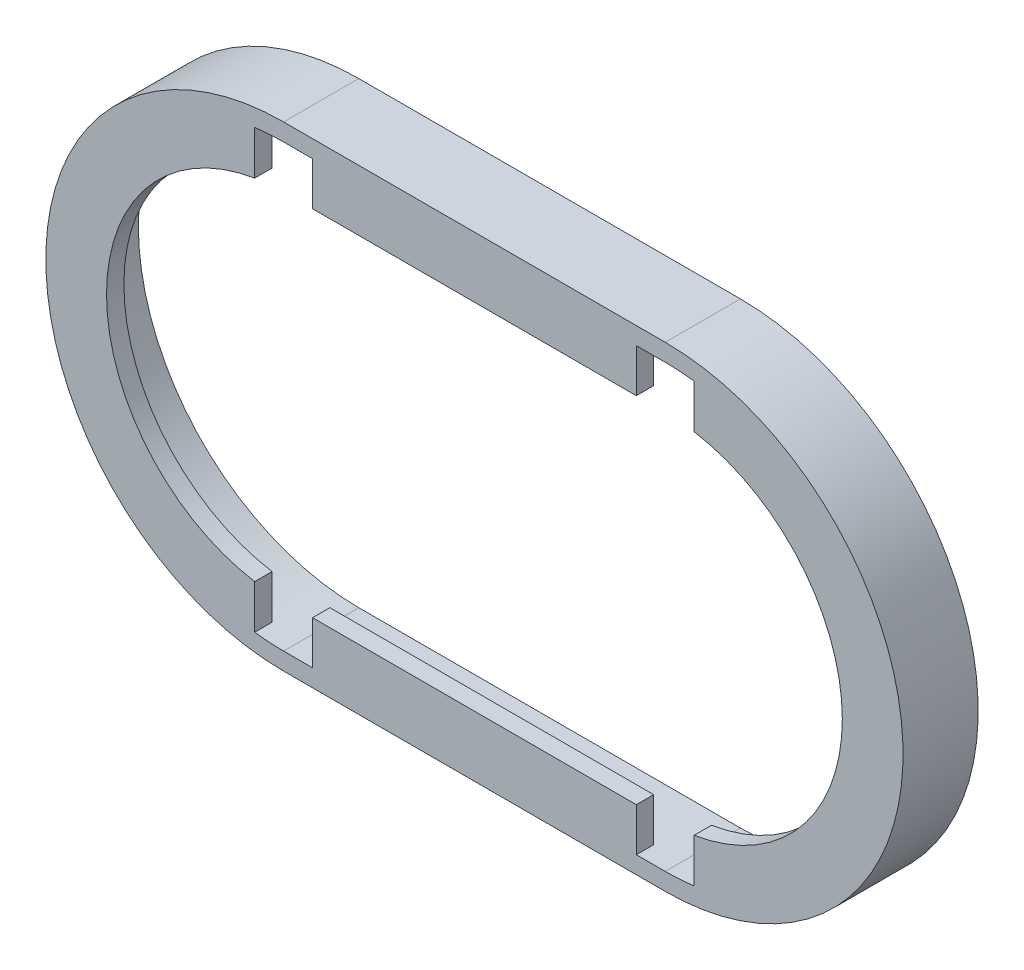
ISO-10303-21;
HEADER;
FILE_DESCRIPTION(('STEP AP214'),'2;1');
FILE_NAME('part.step','',(''),(''),'','','');
FILE_SCHEMA(('AUTOMOTIVE_DESIGN { 1 0 10303 214 1 1 1 1 }'));
ENDSEC;
DATA;
#1=APPLICATION_CONTEXT('core data for automotive mechanical design processes');
#2=APPLICATION_PROTOCOL_DEFINITION('international standard','automotive_design',2000,#1);
#3=PRODUCT_CONTEXT('',#1,'mechanical');
#4=PRODUCT('Part','Part','',(#3));
#5=PRODUCT_RELATED_PRODUCT_CATEGORY('part','',(#4));
#6=PRODUCT_DEFINITION_FORMATION('','',#4);
#7=PRODUCT_DEFINITION_CONTEXT('part definition',#1,'design');
#8=PRODUCT_DEFINITION('design','',#6,#7);
#9=PRODUCT_DEFINITION_SHAPE('','',#8);
#10=(LENGTH_UNIT() NAMED_UNIT(*) SI_UNIT(.MILLI.,.METRE.));
#11=(NAMED_UNIT(*) PLANE_ANGLE_UNIT() SI_UNIT($,.RADIAN.));
#12=(NAMED_UNIT(*) SI_UNIT($,.STERADIAN.) SOLID_ANGLE_UNIT());
#13=UNCERTAINTY_MEASURE_WITH_UNIT(LENGTH_MEASURE(1.E-05),#10,'distance_accuracy_value','');
#14=(GEOMETRIC_REPRESENTATION_CONTEXT(3) GLOBAL_UNCERTAINTY_ASSIGNED_CONTEXT((#13)) GLOBAL_UNIT_ASSIGNED_CONTEXT((#10,
#11,#12)) REPRESENTATION_CONTEXT('',''));
#15=CARTESIAN_POINT('',(0.,0.,0.));
#16=DIRECTION('',(0.,0.,1.));
#17=DIRECTION('',(1.,0.,0.));
#18=AXIS2_PLACEMENT_3D('',#15,#16,#17);
#19=CARTESIAN_POINT('',(-7.98444418883663,3.46921661919615,-4.));
#20=DIRECTION('',(0.,0.,1.));
#21=DIRECTION('',(1.,0.,0.));
#22=AXIS2_PLACEMENT_3D('',#19,#20,#21);
#23=CYLINDRICAL_SURFACE('',#22,15.25);
#24=DIRECTION('',(0.,0.,-1.));
#25=VECTOR('',#24,1.);
#26=CARTESIAN_POINT('',(-5.98444418883663,18.587500251937,34.2123083106892));
#27=LINE('',#26,#25);
#28=CARTESIAN_POINT('',(-5.98444418883663,18.587500251937,1.2));
#29=VERTEX_POINT('',#28);
#30=CARTESIAN_POINT('',(-5.98444418883663,18.587500251937,0.));
#31=VERTEX_POINT('',#30);
#32=EDGE_CURVE('E239',#29,#31,#27,.T.);
#33=ORIENTED_EDGE('',*,*,#32,.F.);
#34=CARTESIAN_POINT('',(-7.98444418883663,3.46921661919615,1.2));
#35=DIRECTION('',(0.,0.,1.));
#36=DIRECTION('',(1.,0.,0.));
#37=AXIS2_PLACEMENT_3D('',#34,#35,#36);
#38=CIRCLE('',#37,15.25);
#39=CARTESIAN_POINT('',(-7.98444418883663,18.7192166191962,1.2));
#40=VERTEX_POINT('',#39);
#41=EDGE_CURVE('E318',#29,#40,#38,.T.);
#42=ORIENTED_EDGE('',*,*,#41,.T.);
#43=DIRECTION('',(0.,0.,1.));
#44=VECTOR('',#43,1.);
#45=CARTESIAN_POINT('',(-7.98444418883663,18.7192166191962,-4.));
#46=LINE('',#45,#44);
#47=CARTESIAN_POINT('',(-7.98444418883663,18.7192166191962,-4.));
#48=VERTEX_POINT('',#47);
#49=EDGE_CURVE('E353',#48,#40,#46,.T.);
#50=ORIENTED_EDGE('',*,*,#49,.F.);
#51=CARTESIAN_POINT('',(-7.98444418883663,3.46921661919615,-4.));
#52=DIRECTION('',(0.,0.,1.));
#53=DIRECTION('',(1.,0.,0.));
#54=AXIS2_PLACEMENT_3D('',#51,#52,#53);
#55=CIRCLE('',#54,15.25);
#56=CARTESIAN_POINT('',(-7.98444418883663,-11.7807833808038,-4.));
#57=VERTEX_POINT('',#56);
#58=EDGE_CURVE('E342',#57,#48,#55,.T.);
#59=ORIENTED_EDGE('',*,*,#58,.F.);
#60=DIRECTION('',(0.,0.,1.));
#61=VECTOR('',#60,1.);
#62=CARTESIAN_POINT('',(-7.98444418883663,-11.7807833808038,-4.));
#63=LINE('',#62,#61);
#64=CARTESIAN_POINT('',(-7.98444418883663,-11.7807833808038,1.2));
#65=VERTEX_POINT('',#64);
#66=EDGE_CURVE('E356',#57,#65,#63,.T.);
#67=ORIENTED_EDGE('',*,*,#66,.T.);
#68=CARTESIAN_POINT('',(-5.98444418883663,-11.6490670135447,1.2));
#69=VERTEX_POINT('',#68);
#70=EDGE_CURVE('E319',#65,#69,#38,.T.);
#71=ORIENTED_EDGE('',*,*,#70,.T.);
#72=DIRECTION('',(0.,0.,-1.));
#73=VECTOR('',#72,1.);
#74=CARTESIAN_POINT('',(-5.98444418883663,-11.6490670135447,34.2123083106892));
#75=LINE('',#74,#73);
#76=CARTESIAN_POINT('',(-5.98444418883663,-11.6490670135447,0.));
#77=VERTEX_POINT('',#76);
#78=EDGE_CURVE('E238',#69,#77,#75,.T.);
#79=ORIENTED_EDGE('',*,*,#78,.T.);
#80=CARTESIAN_POINT('',(-7.98444418883663,3.46921661919615,0.));
#81=DIRECTION('',(0.,0.,1.));
#82=DIRECTION('',(1.,0.,0.));
#83=AXIS2_PLACEMENT_3D('',#80,#81,#82);
#84=CIRCLE('',#83,15.25);
#85=EDGE_CURVE('E240',#77,#31,#84,.T.);
#86=ORIENTED_EDGE('',*,*,#85,.T.);
#87=EDGE_LOOP('',(#33,#42,#50,#59,#67,#71,#79,#86));
#88=FACE_BOUND('',#87,.T.);
#89=ADVANCED_FACE('F35',(#88),#23,.F.);
#90=CARTESIAN_POINT('',(-34.3844441888366,18.7192166191961,-4.));
#91=DIRECTION('',(0.,1.,0.));
#92=DIRECTION('',(-1.,0.,0.));
#93=AXIS2_PLACEMENT_3D('',#90,#91,#92);
#94=PLANE('',#93);
#95=DIRECTION('',(0.,0.,-1.));
#96=VECTOR('',#95,1.);
#97=CARTESIAN_POINT('',(-32.3844441888366,18.7192166191962,34.2123083106892));
#98=LINE('',#97,#96);
#99=CARTESIAN_POINT('',(-32.3844441888366,18.7192166191962,1.2));
#100=VERTEX_POINT('',#99);
#101=CARTESIAN_POINT('',(-32.3844441888366,18.7192166191961,0.));
#102=VERTEX_POINT('',#101);
#103=EDGE_CURVE('E268',#100,#102,#98,.T.);
#104=ORIENTED_EDGE('',*,*,#103,.F.);
#105=DIRECTION('',(-1.,0.,0.));
#106=VECTOR('',#105,1.);
#107=CARTESIAN_POINT('',(-34.3844441888366,18.7192166191961,1.2));
#108=LINE('',#107,#106);
#109=CARTESIAN_POINT('',(-34.3844441888366,18.7192166191961,1.2));
#110=VERTEX_POINT('',#109);
#111=EDGE_CURVE('E321',#100,#110,#108,.T.);
#112=ORIENTED_EDGE('',*,*,#111,.T.);
#113=DIRECTION('',(0.,0.,1.));
#114=VECTOR('',#113,1.);
#115=CARTESIAN_POINT('',(-34.3844441888366,18.7192166191961,-4.));
#116=LINE('',#115,#114);
#117=CARTESIAN_POINT('',(-34.3844441888366,18.7192166191961,-4.));
#118=VERTEX_POINT('',#117);
#119=EDGE_CURVE('E349',#118,#110,#116,.T.);
#120=ORIENTED_EDGE('',*,*,#119,.F.);
#121=DIRECTION('',(-1.,0.,0.));
#122=VECTOR('',#121,1.);
#123=CARTESIAN_POINT('',(-34.3844441888366,18.7192166191961,-4.));
#124=LINE('',#123,#122);
#125=EDGE_CURVE('E345',#48,#118,#124,.T.);
#126=ORIENTED_EDGE('',*,*,#125,.F.);
#127=ORIENTED_EDGE('',*,*,#49,.T.);
#128=CARTESIAN_POINT('',(-9.98444418883663,18.7192166191962,1.2));
#129=VERTEX_POINT('',#128);
#130=EDGE_CURVE('E322',#40,#129,#108,.T.);
#131=ORIENTED_EDGE('',*,*,#130,.T.);
#132=DIRECTION('',(0.,0.,-1.));
#133=VECTOR('',#132,1.);
#134=CARTESIAN_POINT('',(-9.98444418883663,18.7192166191961,34.2123083106892));
#135=LINE('',#134,#133);
#136=CARTESIAN_POINT('',(-9.98444418883663,18.7192166191962,0.));
#137=VERTEX_POINT('',#136);
#138=EDGE_CURVE('E267',#129,#137,#135,.T.);
#139=ORIENTED_EDGE('',*,*,#138,.T.);
#140=DIRECTION('',(-1.,0.,0.));
#141=VECTOR('',#140,1.);
#142=CARTESIAN_POINT('',(0.,18.7192166191961,0.));
#143=LINE('',#142,#141);
#144=EDGE_CURVE('E269',#137,#102,#143,.T.);
#145=ORIENTED_EDGE('',*,*,#144,.T.);
#146=EDGE_LOOP('',(#104,#112,#120,#126,#127,#131,#139,#145));
#147=FACE_BOUND('',#146,.T.);
#148=ADVANCED_FACE('F399',(#147),#94,.F.);
#149=CARTESIAN_POINT('',(-34.3844441888366,3.46921661919615,-4.));
#150=DIRECTION('',(0.,0.,1.));
#151=DIRECTION('',(1.,0.,0.));
#152=AXIS2_PLACEMENT_3D('',#149,#150,#151);
#153=CYLINDRICAL_SURFACE('',#152,16.45);
#154=DIRECTION('',(0.,0.,1.));
#155=VECTOR('',#154,1.);
#156=CARTESIAN_POINT('',(-34.3844441888366,-12.9807833808038,-4.));
#157=LINE('',#156,#155);
#158=CARTESIAN_POINT('',(-34.3844441888366,-12.9807833808038,-4.));
#159=VERTEX_POINT('',#158);
#160=CARTESIAN_POINT('',(-34.3844441888366,-12.9807833808038,1.2));
#161=VERTEX_POINT('',#160);
#162=EDGE_CURVE('E39',#159,#161,#157,.T.);
#163=ORIENTED_EDGE('',*,*,#162,.T.);
#164=CARTESIAN_POINT('',(-34.3844441888366,3.46921661919615,1.2));
#165=DIRECTION('',(0.,0.,1.));
#166=DIRECTION('',(1.,0.,0.));
#167=AXIS2_PLACEMENT_3D('',#164,#165,#166);
#168=CIRCLE('',#167,16.45);
#169=CARTESIAN_POINT('',(-34.3844441888366,19.9192166191961,1.2));
#170=VERTEX_POINT('',#169);
#171=EDGE_CURVE('E324',#170,#161,#168,.T.);
#172=ORIENTED_EDGE('',*,*,#171,.F.);
#173=DIRECTION('',(0.,0.,1.));
#174=VECTOR('',#173,1.);
#175=CARTESIAN_POINT('',(-34.3844441888366,19.9192166191961,-4.));
#176=LINE('',#175,#174);
#177=CARTESIAN_POINT('',(-34.3844441888366,19.9192166191961,-4.));
#178=VERTEX_POINT('',#177);
#179=EDGE_CURVE('E11',#178,#170,#176,.T.);
#180=ORIENTED_EDGE('',*,*,#179,.F.);
#181=CARTESIAN_POINT('',(-34.3844441888366,3.46921661919615,-4.));
#182=DIRECTION('',(0.,0.,1.));
#183=DIRECTION('',(1.,0.,0.));
#184=AXIS2_PLACEMENT_3D('',#181,#182,#183);
#185=CIRCLE('',#184,16.45);
#186=EDGE_CURVE('E352',#178,#159,#185,.T.);
#187=ORIENTED_EDGE('',*,*,#186,.T.);
#188=EDGE_LOOP('',(#163,#172,#180,#187));
#189=FACE_BOUND('',#188,.T.);
#190=ADVANCED_FACE('F37',(#189),#153,.T.);
#191=CARTESIAN_POINT('',(-34.3844441888366,19.9192166191961,-4.));
#192=DIRECTION('',(0.,1.,0.));
#193=DIRECTION('',(0.,0.,1.));
#194=AXIS2_PLACEMENT_3D('',#191,#192,#193);
#195=PLANE('',#194);
#196=ORIENTED_EDGE('',*,*,#179,.T.);
#197=DIRECTION('',(-1.,0.,0.));
#198=VECTOR('',#197,1.);
#199=CARTESIAN_POINT('',(-34.3844441888366,19.9192166191961,1.2));
#200=LINE('',#199,#198);
#201=CARTESIAN_POINT('',(-7.98444418883663,19.9192166191961,1.2));
#202=VERTEX_POINT('',#201);
#203=EDGE_CURVE('E333',#202,#170,#200,.T.);
#204=ORIENTED_EDGE('',*,*,#203,.F.);
#205=DIRECTION('',(0.,0.,1.));
#206=VECTOR('',#205,1.);
#207=CARTESIAN_POINT('',(-7.98444418883663,19.9192166191961,-4.));
#208=LINE('',#207,#206);
#209=CARTESIAN_POINT('',(-7.98444418883663,19.9192166191961,-4.));
#210=VERTEX_POINT('',#209);
#211=EDGE_CURVE('E44',#210,#202,#208,.T.);
#212=ORIENTED_EDGE('',*,*,#211,.F.);
#213=DIRECTION('',(-1.,0.,0.));
#214=VECTOR('',#213,1.);
#215=CARTESIAN_POINT('',(-34.3844441888366,19.9192166191961,-4.));
#216=LINE('',#215,#214);
#217=EDGE_CURVE('E369',#210,#178,#216,.T.);
#218=ORIENTED_EDGE('',*,*,#217,.T.);
#219=EDGE_LOOP('',(#196,#204,#212,#218));
#220=FACE_BOUND('',#219,.T.);
#221=ADVANCED_FACE('F384',(#220),#195,.T.);
#222=CARTESIAN_POINT('',(-7.98444418883663,3.46921661919615,-4.));
#223=DIRECTION('',(0.,0.,1.));
#224=DIRECTION('',(1.,0.,0.));
#225=AXIS2_PLACEMENT_3D('',#222,#223,#224);
#226=CYLINDRICAL_SURFACE('',#225,16.45);
#227=ORIENTED_EDGE('',*,*,#211,.T.);
#228=CARTESIAN_POINT('',(-7.98444418883663,3.46921661919615,1.2));
#229=DIRECTION('',(0.,0.,1.));
#230=DIRECTION('',(1.,0.,0.));
#231=AXIS2_PLACEMENT_3D('',#228,#229,#230);
#232=CIRCLE('',#231,16.45);
#233=CARTESIAN_POINT('',(-7.98444418883663,-12.9807833808038,1.2));
#234=VERTEX_POINT('',#233);
#235=EDGE_CURVE('E330',#234,#202,#232,.T.);
#236=ORIENTED_EDGE('',*,*,#235,.F.);
#237=DIRECTION('',(0.,0.,1.));
#238=VECTOR('',#237,1.);
#239=CARTESIAN_POINT('',(-7.98444418883663,-12.9807833808038,-4.));
#240=LINE('',#239,#238);
#241=CARTESIAN_POINT('',(-7.98444418883663,-12.9807833808038,-4.));
#242=VERTEX_POINT('',#241);
#243=EDGE_CURVE('E372',#242,#234,#240,.T.);
#244=ORIENTED_EDGE('',*,*,#243,.F.);
#245=CARTESIAN_POINT('',(-7.98444418883663,3.46921661919615,-4.));
#246=DIRECTION('',(0.,0.,1.));
#247=DIRECTION('',(1.,0.,0.));
#248=AXIS2_PLACEMENT_3D('',#245,#246,#247);
#249=CIRCLE('',#248,16.45);
#250=EDGE_CURVE('E366',#242,#210,#249,.T.);
#251=ORIENTED_EDGE('',*,*,#250,.T.);
#252=EDGE_LOOP('',(#227,#236,#244,#251));
#253=FACE_BOUND('',#252,.T.);
#254=ADVANCED_FACE('F390',(#253),#226,.T.);
#255=CARTESIAN_POINT('',(-7.98444418883663,-12.9807833808038,-4.));
#256=DIRECTION('',(0.,-1.,0.));
#257=DIRECTION('',(0.,0.,-1.));
#258=AXIS2_PLACEMENT_3D('',#255,#256,#257);
#259=PLANE('',#258);
#260=ORIENTED_EDGE('',*,*,#243,.T.);
#261=DIRECTION('',(1.,0.,0.));
#262=VECTOR('',#261,1.);
#263=CARTESIAN_POINT('',(-7.98444418883663,-12.9807833808038,1.2));
#264=LINE('',#263,#262);
#265=EDGE_CURVE('E327',#161,#234,#264,.T.);
#266=ORIENTED_EDGE('',*,*,#265,.F.);
#267=ORIENTED_EDGE('',*,*,#162,.F.);
#268=DIRECTION('',(1.,0.,0.));
#269=VECTOR('',#268,1.);
#270=CARTESIAN_POINT('',(-7.98444418883663,-12.9807833808038,-4.));
#271=LINE('',#270,#269);
#272=EDGE_CURVE('E363',#159,#242,#271,.T.);
#273=ORIENTED_EDGE('',*,*,#272,.T.);
#274=EDGE_LOOP('',(#260,#266,#267,#273));
#275=FACE_BOUND('',#274,.T.);
#276=ADVANCED_FACE('F379',(#275),#259,.T.);
#277=CARTESIAN_POINT('',(-34.3844441888366,3.46921661919615,-4.));
#278=DIRECTION('',(0.,0.,1.));
#279=DIRECTION('',(1.,0.,0.));
#280=AXIS2_PLACEMENT_3D('',#277,#278,#279);
#281=PLANE('',#280);
#282=ORIENTED_EDGE('',*,*,#125,.T.);
#283=CARTESIAN_POINT('',(-34.3844441888366,3.46921661919615,-4.));
#284=DIRECTION('',(0.,0.,1.));
#285=DIRECTION('',(1.,0.,0.));
#286=AXIS2_PLACEMENT_3D('',#283,#284,#285);
#287=CIRCLE('',#286,15.25);
#288=CARTESIAN_POINT('',(-34.3844441888366,-11.7807833808038,-4.));
#289=VERTEX_POINT('',#288);
#290=EDGE_CURVE('E336',#118,#289,#287,.T.);
#291=ORIENTED_EDGE('',*,*,#290,.T.);
#292=DIRECTION('',(1.,0.,0.));
#293=VECTOR('',#292,1.);
#294=CARTESIAN_POINT('',(-7.98444418883663,-11.7807833808038,-4.));
#295=LINE('',#294,#293);
#296=EDGE_CURVE('E339',#289,#57,#295,.T.);
#297=ORIENTED_EDGE('',*,*,#296,.T.);
#298=ORIENTED_EDGE('',*,*,#58,.T.);
#299=EDGE_LOOP('',(#282,#291,#297,#298));
#300=FACE_BOUND('',#299,.T.);
#301=ORIENTED_EDGE('',*,*,#186,.F.);
#302=ORIENTED_EDGE('',*,*,#217,.F.);
#303=ORIENTED_EDGE('',*,*,#250,.F.);
#304=ORIENTED_EDGE('',*,*,#272,.F.);
#305=EDGE_LOOP('',(#301,#302,#303,#304));
#306=FACE_BOUND('',#305,.T.);
#307=ADVANCED_FACE('F387',(#300,#306),#281,.F.);
#308=CARTESIAN_POINT('',(-34.3844441888366,3.46921661919615,-4.));
#309=DIRECTION('',(0.,0.,1.));
#310=DIRECTION('',(1.,0.,0.));
#311=AXIS2_PLACEMENT_3D('',#308,#309,#310);
#312=CYLINDRICAL_SURFACE('',#311,15.25);
#313=CARTESIAN_POINT('',(-34.3844441888366,3.46921661919615,0.));
#314=DIRECTION('',(0.,0.,1.));
#315=DIRECTION('',(1.,0.,0.));
#316=AXIS2_PLACEMENT_3D('',#313,#314,#315);
#317=CIRCLE('',#316,15.25);
#318=CARTESIAN_POINT('',(-36.3844441888366,18.587500251937,0.));
#319=VERTEX_POINT('',#318);
#320=CARTESIAN_POINT('',(-36.3844441888366,-11.6490670135447,0.));
#321=VERTEX_POINT('',#320);
#322=EDGE_CURVE('E291',#319,#321,#317,.T.);
#323=ORIENTED_EDGE('',*,*,#322,.T.);
#324=DIRECTION('',(0.,0.,-1.));
#325=VECTOR('',#324,1.);
#326=CARTESIAN_POINT('',(-36.3844441888366,-11.6490670135447,34.2123083106892));
#327=LINE('',#326,#325);
#328=CARTESIAN_POINT('',(-36.3844441888366,-11.6490670135447,1.2));
#329=VERTEX_POINT('',#328);
#330=EDGE_CURVE('E307',#329,#321,#327,.T.);
#331=ORIENTED_EDGE('',*,*,#330,.F.);
#332=CARTESIAN_POINT('',(-34.3844441888366,3.46921661919615,1.2));
#333=DIRECTION('',(0.,0.,1.));
#334=DIRECTION('',(1.,0.,0.));
#335=AXIS2_PLACEMENT_3D('',#332,#333,#334);
#336=CIRCLE('',#335,15.25);
#337=CARTESIAN_POINT('',(-34.3844441888366,-11.7807833808038,1.2));
#338=VERTEX_POINT('',#337);
#339=EDGE_CURVE('E313',#329,#338,#336,.T.);
#340=ORIENTED_EDGE('',*,*,#339,.T.);
#341=DIRECTION('',(0.,0.,1.));
#342=VECTOR('',#341,1.);
#343=CARTESIAN_POINT('',(-34.3844441888366,-11.7807833808038,-4.));
#344=LINE('',#343,#342);
#345=EDGE_CURVE('E348',#289,#338,#344,.T.);
#346=ORIENTED_EDGE('',*,*,#345,.F.);
#347=ORIENTED_EDGE('',*,*,#290,.F.);
#348=ORIENTED_EDGE('',*,*,#119,.T.);
#349=CARTESIAN_POINT('',(-36.3844441888366,18.587500251937,1.2));
#350=VERTEX_POINT('',#349);
#351=EDGE_CURVE('E314',#110,#350,#336,.T.);
#352=ORIENTED_EDGE('',*,*,#351,.T.);
#353=DIRECTION('',(0.,0.,-1.));
#354=VECTOR('',#353,1.);
#355=CARTESIAN_POINT('',(-36.3844441888366,18.587500251937,34.2123083106892));
#356=LINE('',#355,#354);
#357=EDGE_CURVE('E294',#350,#319,#356,.T.);
#358=ORIENTED_EDGE('',*,*,#357,.T.);
#359=EDGE_LOOP('',(#323,#331,#340,#346,#347,#348,#352,#358));
#360=FACE_BOUND('',#359,.T.);
#361=ADVANCED_FACE('F413',(#360),#312,.F.);
#362=CARTESIAN_POINT('',(-7.98444418883663,-11.7807833808038,-4.));
#363=DIRECTION('',(0.,-1.,0.));
#364=DIRECTION('',(0.,0.,-1.));
#365=AXIS2_PLACEMENT_3D('',#362,#363,#364);
#366=PLANE('',#365);
#367=DIRECTION('',(1.,0.,0.));
#368=VECTOR('',#367,1.);
#369=CARTESIAN_POINT('',(0.,-11.7807833808038,0.));
#370=LINE('',#369,#368);
#371=CARTESIAN_POINT('',(-32.3844441888366,-11.7807833808038,0.));
#372=VERTEX_POINT('',#371);
#373=CARTESIAN_POINT('',(-9.98444418883663,-11.7807833808038,0.));
#374=VERTEX_POINT('',#373);
#375=EDGE_CURVE('E57',#372,#374,#370,.T.);
#376=ORIENTED_EDGE('',*,*,#375,.T.);
#377=DIRECTION('',(0.,0.,-1.));
#378=VECTOR('',#377,1.);
#379=CARTESIAN_POINT('',(-9.98444418883663,-11.7807833808038,34.2123083106892));
#380=LINE('',#379,#378);
#381=CARTESIAN_POINT('',(-9.98444418883663,-11.7807833808038,1.2));
#382=VERTEX_POINT('',#381);
#383=EDGE_CURVE('E217',#382,#374,#380,.T.);
#384=ORIENTED_EDGE('',*,*,#383,.F.);
#385=DIRECTION('',(1.,0.,0.));
#386=VECTOR('',#385,1.);
#387=CARTESIAN_POINT('',(-7.98444418883663,-11.7807833808038,1.2));
#388=LINE('',#387,#386);
#389=EDGE_CURVE('E222',#382,#65,#388,.T.);
#390=ORIENTED_EDGE('',*,*,#389,.T.);
#391=ORIENTED_EDGE('',*,*,#66,.F.);
#392=ORIENTED_EDGE('',*,*,#296,.F.);
#393=ORIENTED_EDGE('',*,*,#345,.T.);
#394=CARTESIAN_POINT('',(-32.3844441888366,-11.7807833808038,1.2));
#395=VERTEX_POINT('',#394);
#396=EDGE_CURVE('E316',#338,#395,#388,.T.);
#397=ORIENTED_EDGE('',*,*,#396,.T.);
#398=DIRECTION('',(0.,0.,-1.));
#399=VECTOR('',#398,1.);
#400=CARTESIAN_POINT('',(-32.3844441888366,-11.7807833808038,34.2123083106892));
#401=LINE('',#400,#399);
#402=EDGE_CURVE('E52',#395,#372,#401,.T.);
#403=ORIENTED_EDGE('',*,*,#402,.T.);
#404=EDGE_LOOP('',(#376,#384,#390,#391,#392,#393,#397,#403));
#405=FACE_BOUND('',#404,.T.);
#406=ADVANCED_FACE('F410',(#405),#366,.F.);
#407=CARTESIAN_POINT('',(-34.3844441888366,3.46921661919615,1.2));
#408=DIRECTION('',(0.,0.,1.));
#409=DIRECTION('',(1.,0.,0.));
#410=AXIS2_PLACEMENT_3D('',#407,#408,#409);
#411=PLANE('',#410);
#412=ORIENTED_EDGE('',*,*,#171,.T.);
#413=ORIENTED_EDGE('',*,*,#265,.T.);
#414=ORIENTED_EDGE('',*,*,#235,.T.);
#415=ORIENTED_EDGE('',*,*,#203,.T.);
#416=EDGE_LOOP('',(#412,#413,#414,#415));
#417=FACE_BOUND('',#416,.T.);
#418=ORIENTED_EDGE('',*,*,#396,.F.);
#419=ORIENTED_EDGE('',*,*,#339,.F.);
#420=DIRECTION('',(0.,-1.,0.));
#421=VECTOR('',#420,1.);
#422=CARTESIAN_POINT('',(-36.3844441888366,0.,1.2));
#423=LINE('',#422,#421);
#424=CARTESIAN_POINT('',(-36.3844441888366,-8.61641534607567,1.2));
#425=VERTEX_POINT('',#424);
#426=EDGE_CURVE('E304',#425,#329,#423,.T.);
#427=ORIENTED_EDGE('',*,*,#426,.F.);
#428=CARTESIAN_POINT('',(-34.3844441888366,3.46921661919615,1.2));
#429=DIRECTION('',(0.,0.,1.));
#430=DIRECTION('',(1.,0.,0.));
#431=AXIS2_PLACEMENT_3D('',#428,#429,#430);
#432=CIRCLE('',#431,12.25);
#433=CARTESIAN_POINT('',(-36.3844441888366,15.554848584468,1.2));
#434=VERTEX_POINT('',#433);
#435=EDGE_CURVE('E297',#434,#425,#432,.T.);
#436=ORIENTED_EDGE('',*,*,#435,.F.);
#437=DIRECTION('',(0.,-1.,0.));
#438=VECTOR('',#437,1.);
#439=CARTESIAN_POINT('',(-36.3844441888366,0.,1.2));
#440=LINE('',#439,#438);
#441=EDGE_CURVE('E293',#350,#434,#440,.T.);
#442=ORIENTED_EDGE('',*,*,#441,.F.);
#443=ORIENTED_EDGE('',*,*,#351,.F.);
#444=ORIENTED_EDGE('',*,*,#111,.F.);
#445=DIRECTION('',(0.,-1.,0.));
#446=VECTOR('',#445,1.);
#447=CARTESIAN_POINT('',(-32.3844441888366,0.,1.2));
#448=LINE('',#447,#446);
#449=CARTESIAN_POINT('',(-32.3844441888366,15.7192166191962,1.2));
#450=VERTEX_POINT('',#449);
#451=EDGE_CURVE('E246',#100,#450,#448,.T.);
#452=ORIENTED_EDGE('',*,*,#451,.T.);
#453=DIRECTION('',(-1.,0.,0.));
#454=VECTOR('',#453,1.);
#455=CARTESIAN_POINT('',(0.,15.7192166191962,1.2));
#456=LINE('',#455,#454);
#457=CARTESIAN_POINT('',(-9.98444418883663,15.7192166191962,1.2));
#458=VERTEX_POINT('',#457);
#459=EDGE_CURVE('E262',#458,#450,#456,.T.);
#460=ORIENTED_EDGE('',*,*,#459,.F.);
#461=DIRECTION('',(0.,-1.,0.));
#462=VECTOR('',#461,1.);
#463=CARTESIAN_POINT('',(-9.98444418883663,0.,1.2));
#464=LINE('',#463,#462);
#465=EDGE_CURVE('E271',#129,#458,#464,.T.);
#466=ORIENTED_EDGE('',*,*,#465,.F.);
#467=ORIENTED_EDGE('',*,*,#130,.F.);
#468=ORIENTED_EDGE('',*,*,#41,.F.);
#469=DIRECTION('',(0.,-1.,0.));
#470=VECTOR('',#469,1.);
#471=CARTESIAN_POINT('',(-5.98444418883663,0.,1.2));
#472=LINE('',#471,#470);
#473=CARTESIAN_POINT('',(-5.98444418883663,15.554848584468,1.2));
#474=VERTEX_POINT('',#473);
#475=EDGE_CURVE('E234',#29,#474,#472,.T.);
#476=ORIENTED_EDGE('',*,*,#475,.T.);
#477=CARTESIAN_POINT('',(-7.98444418883663,3.46921661919615,1.2));
#478=DIRECTION('',(0.,0.,1.));
#479=DIRECTION('',(1.,0.,0.));
#480=AXIS2_PLACEMENT_3D('',#477,#478,#479);
#481=CIRCLE('',#480,12.25);
#482=CARTESIAN_POINT('',(-5.98444418883663,-8.61641534607567,1.2));
#483=VERTEX_POINT('',#482);
#484=EDGE_CURVE('E233',#483,#474,#481,.T.);
#485=ORIENTED_EDGE('',*,*,#484,.F.);
#486=DIRECTION('',(0.,-1.,0.));
#487=VECTOR('',#486,1.);
#488=CARTESIAN_POINT('',(-5.98444418883663,0.,1.2));
#489=LINE('',#488,#487);
#490=EDGE_CURVE('E250',#483,#69,#489,.T.);
#491=ORIENTED_EDGE('',*,*,#490,.T.);
#492=ORIENTED_EDGE('',*,*,#70,.F.);
#493=ORIENTED_EDGE('',*,*,#389,.F.);
#494=DIRECTION('',(0.,-1.,0.));
#495=VECTOR('',#494,1.);
#496=CARTESIAN_POINT('',(-9.98444418883663,0.,1.2));
#497=LINE('',#496,#495);
#498=CARTESIAN_POINT('',(-9.98444418883663,-8.78078338080385,1.2));
#499=VERTEX_POINT('',#498);
#500=EDGE_CURVE('E214',#499,#382,#497,.T.);
#501=ORIENTED_EDGE('',*,*,#500,.F.);
#502=DIRECTION('',(-1.,0.,0.));
#503=VECTOR('',#502,1.);
#504=CARTESIAN_POINT('',(0.,-8.78078338080385,1.2));
#505=LINE('',#504,#503);
#506=CARTESIAN_POINT('',(-32.3844441888366,-8.78078338080385,1.2));
#507=VERTEX_POINT('',#506);
#508=EDGE_CURVE('E197',#499,#507,#505,.T.);
#509=ORIENTED_EDGE('',*,*,#508,.T.);
#510=DIRECTION('',(0.,-1.,0.));
#511=VECTOR('',#510,1.);
#512=CARTESIAN_POINT('',(-32.3844441888366,0.,1.2));
#513=LINE('',#512,#511);
#514=EDGE_CURVE('E207',#507,#395,#513,.T.);
#515=ORIENTED_EDGE('',*,*,#514,.T.);
#516=EDGE_LOOP('',(#418,#419,#427,#436,#442,#443,#444,#452,#460,#466,#467,#468,#476,#485,#491,
#492,#493,#501,#509,#515));
#517=FACE_BOUND('',#516,.T.);
#518=ADVANCED_FACE('F220',(#417,#517),#411,.T.);
#519=CARTESIAN_POINT('',(0.,0.,0.));
#520=DIRECTION('',(0.,0.,1.));
#521=DIRECTION('',(1.,0.,0.));
#522=AXIS2_PLACEMENT_3D('',#519,#520,#521);
#523=PLANE('',#522);
#524=DIRECTION('',(0.,-1.,0.));
#525=VECTOR('',#524,1.);
#526=CARTESIAN_POINT('',(-36.3844441888366,0.,0.));
#527=LINE('',#526,#525);
#528=CARTESIAN_POINT('',(-36.3844441888366,15.554848584468,0.));
#529=VERTEX_POINT('',#528);
#530=EDGE_CURVE('E286',#319,#529,#527,.T.);
#531=ORIENTED_EDGE('',*,*,#530,.T.);
#532=CARTESIAN_POINT('',(-34.3844441888366,3.46921661919615,0.));
#533=DIRECTION('',(0.,0.,1.));
#534=DIRECTION('',(1.,0.,0.));
#535=AXIS2_PLACEMENT_3D('',#532,#533,#534);
#536=CIRCLE('',#535,12.25);
#537=CARTESIAN_POINT('',(-36.3844441888366,-8.61641534607567,0.));
#538=VERTEX_POINT('',#537);
#539=EDGE_CURVE('E287',#529,#538,#536,.T.);
#540=ORIENTED_EDGE('',*,*,#539,.T.);
#541=EDGE_CURVE('E290',#538,#321,#527,.T.);
#542=ORIENTED_EDGE('',*,*,#541,.T.);
#543=ORIENTED_EDGE('',*,*,#322,.F.);
#544=EDGE_LOOP('',(#531,#540,#542,#543));
#545=FACE_BOUND('',#544,.T.);
#546=ADVANCED_FACE('F468',(#545),#523,.F.);
#547=CARTESIAN_POINT('',(-34.3844441888366,3.46921661919615,34.2123083106892));
#548=DIRECTION('',(0.,0.,-1.));
#549=DIRECTION('',(-1.,0.,0.));
#550=AXIS2_PLACEMENT_3D('',#547,#548,#549);
#551=CYLINDRICAL_SURFACE('',#550,12.25);
#552=DIRECTION('',(0.,0.,-1.));
#553=VECTOR('',#552,1.);
#554=CARTESIAN_POINT('',(-36.3844441888366,15.554848584468,34.2123083106892));
#555=LINE('',#554,#553);
#556=EDGE_CURVE('E303',#434,#529,#555,.T.);
#557=ORIENTED_EDGE('',*,*,#556,.F.);
#558=ORIENTED_EDGE('',*,*,#435,.T.);
#559=DIRECTION('',(0.,0.,-1.));
#560=VECTOR('',#559,1.);
#561=CARTESIAN_POINT('',(-36.3844441888366,-8.61641534607567,34.2123083106892));
#562=LINE('',#561,#560);
#563=EDGE_CURVE('E300',#425,#538,#562,.T.);
#564=ORIENTED_EDGE('',*,*,#563,.T.);
#565=ORIENTED_EDGE('',*,*,#539,.F.);
#566=EDGE_LOOP('',(#557,#558,#564,#565));
#567=FACE_BOUND('',#566,.T.);
#568=ADVANCED_FACE('F474',(#567),#551,.F.);
#569=CARTESIAN_POINT('',(-36.3844441888366,0.,34.2123083106892));
#570=DIRECTION('',(1.,0.,0.));
#571=DIRECTION('',(0.,0.,-1.));
#572=AXIS2_PLACEMENT_3D('',#569,#570,#571);
#573=PLANE('',#572);
#574=ORIENTED_EDGE('',*,*,#563,.F.);
#575=ORIENTED_EDGE('',*,*,#426,.T.);
#576=ORIENTED_EDGE('',*,*,#330,.T.);
#577=ORIENTED_EDGE('',*,*,#541,.F.);
#578=EDGE_LOOP('',(#574,#575,#576,#577));
#579=FACE_BOUND('',#578,.T.);
#580=ADVANCED_FACE('F477',(#579),#573,.T.);
#581=ORIENTED_EDGE('',*,*,#357,.F.);
#582=ORIENTED_EDGE('',*,*,#441,.T.);
#583=ORIENTED_EDGE('',*,*,#556,.T.);
#584=ORIENTED_EDGE('',*,*,#530,.F.);
#585=EDGE_LOOP('',(#581,#582,#583,#584));
#586=FACE_BOUND('',#585,.T.);
#587=ADVANCED_FACE('F471',(#586),#573,.T.);
#588=CARTESIAN_POINT('',(0.,0.,0.));
#589=DIRECTION('',(0.,0.,1.));
#590=DIRECTION('',(1.,0.,0.));
#591=AXIS2_PLACEMENT_3D('',#588,#589,#590);
#592=PLANE('',#591);
#593=DIRECTION('',(0.,-1.,0.));
#594=VECTOR('',#593,1.);
#595=CARTESIAN_POINT('',(-9.98444418883663,0.,0.));
#596=LINE('',#595,#594);
#597=CARTESIAN_POINT('',(-9.98444418883663,15.7192166191962,0.));
#598=VERTEX_POINT('',#597);
#599=EDGE_CURVE('E263',#137,#598,#596,.T.);
#600=ORIENTED_EDGE('',*,*,#599,.T.);
#601=DIRECTION('',(-1.,0.,0.));
#602=VECTOR('',#601,1.);
#603=CARTESIAN_POINT('',(0.,15.7192166191962,0.));
#604=LINE('',#603,#602);
#605=CARTESIAN_POINT('',(-32.3844441888366,15.7192166191962,0.));
#606=VERTEX_POINT('',#605);
#607=EDGE_CURVE('E259',#598,#606,#604,.T.);
#608=ORIENTED_EDGE('',*,*,#607,.T.);
#609=DIRECTION('',(0.,-1.,0.));
#610=VECTOR('',#609,1.);
#611=CARTESIAN_POINT('',(-32.3844441888366,0.,0.));
#612=LINE('',#611,#610);
#613=EDGE_CURVE('E264',#102,#606,#612,.T.);
#614=ORIENTED_EDGE('',*,*,#613,.F.);
#615=ORIENTED_EDGE('',*,*,#144,.F.);
#616=EDGE_LOOP('',(#600,#608,#614,#615));
#617=FACE_BOUND('',#616,.T.);
#618=ADVANCED_FACE('F451',(#617),#592,.F.);
#619=CARTESIAN_POINT('',(0.,15.7192166191962,34.2123083106892));
#620=DIRECTION('',(0.,-1.,0.));
#621=DIRECTION('',(0.,0.,-1.));
#622=AXIS2_PLACEMENT_3D('',#619,#620,#621);
#623=PLANE('',#622);
#624=DIRECTION('',(0.,0.,-1.));
#625=VECTOR('',#624,1.);
#626=CARTESIAN_POINT('',(-9.98444418883663,15.7192166191962,34.2123083106892));
#627=LINE('',#626,#625);
#628=EDGE_CURVE('E279',#458,#598,#627,.T.);
#629=ORIENTED_EDGE('',*,*,#628,.F.);
#630=ORIENTED_EDGE('',*,*,#459,.T.);
#631=DIRECTION('',(0.,0.,-1.));
#632=VECTOR('',#631,1.);
#633=CARTESIAN_POINT('',(-32.3844441888366,15.7192166191962,34.2123083106892));
#634=LINE('',#633,#632);
#635=EDGE_CURVE('E276',#450,#606,#634,.T.);
#636=ORIENTED_EDGE('',*,*,#635,.T.);
#637=ORIENTED_EDGE('',*,*,#607,.F.);
#638=EDGE_LOOP('',(#629,#630,#636,#637));
#639=FACE_BOUND('',#638,.T.);
#640=ADVANCED_FACE('F456',(#639),#623,.T.);
#641=CARTESIAN_POINT('',(-32.3844441888366,0.,34.2123083106892));
#642=DIRECTION('',(1.,0.,0.));
#643=DIRECTION('',(0.,0.,-1.));
#644=AXIS2_PLACEMENT_3D('',#641,#642,#643);
#645=PLANE('',#644);
#646=ORIENTED_EDGE('',*,*,#451,.F.);
#647=ORIENTED_EDGE('',*,*,#103,.T.);
#648=ORIENTED_EDGE('',*,*,#613,.T.);
#649=ORIENTED_EDGE('',*,*,#635,.F.);
#650=EDGE_LOOP('',(#646,#647,#648,#649));
#651=FACE_BOUND('',#650,.T.);
#652=ADVANCED_FACE('F460',(#651),#645,.F.);
#653=CARTESIAN_POINT('',(-9.98444418883663,0.,34.2123083106892));
#654=DIRECTION('',(1.,0.,0.));
#655=DIRECTION('',(0.,0.,-1.));
#656=AXIS2_PLACEMENT_3D('',#653,#654,#655);
#657=PLANE('',#656);
#658=ORIENTED_EDGE('',*,*,#138,.F.);
#659=ORIENTED_EDGE('',*,*,#465,.T.);
#660=ORIENTED_EDGE('',*,*,#628,.T.);
#661=ORIENTED_EDGE('',*,*,#599,.F.);
#662=EDGE_LOOP('',(#658,#659,#660,#661));
#663=FACE_BOUND('',#662,.T.);
#664=ADVANCED_FACE('F453',(#663),#657,.T.);
#665=CARTESIAN_POINT('',(0.,0.,0.));
#666=DIRECTION('',(0.,0.,1.));
#667=DIRECTION('',(1.,0.,0.));
#668=AXIS2_PLACEMENT_3D('',#665,#666,#667);
#669=PLANE('',#668);
#670=DIRECTION('',(0.,-1.,0.));
#671=VECTOR('',#670,1.);
#672=CARTESIAN_POINT('',(-5.98444418883663,0.,0.));
#673=LINE('',#672,#671);
#674=CARTESIAN_POINT('',(-5.98444418883663,-8.61641534607567,0.));
#675=VERTEX_POINT('',#674);
#676=EDGE_CURVE('E243',#675,#77,#673,.T.);
#677=ORIENTED_EDGE('',*,*,#676,.F.);
#678=CARTESIAN_POINT('',(-7.98444418883663,3.46921661919615,0.));
#679=DIRECTION('',(0.,0.,1.));
#680=DIRECTION('',(1.,0.,0.));
#681=AXIS2_PLACEMENT_3D('',#678,#679,#680);
#682=CIRCLE('',#681,12.25);
#683=CARTESIAN_POINT('',(-5.98444418883663,15.554848584468,0.));
#684=VERTEX_POINT('',#683);
#685=EDGE_CURVE('E230',#675,#684,#682,.T.);
#686=ORIENTED_EDGE('',*,*,#685,.T.);
#687=DIRECTION('',(0.,-1.,0.));
#688=VECTOR('',#687,1.);
#689=CARTESIAN_POINT('',(-5.98444418883663,0.,0.));
#690=LINE('',#689,#688);
#691=EDGE_CURVE('E235',#31,#684,#690,.T.);
#692=ORIENTED_EDGE('',*,*,#691,.F.);
#693=ORIENTED_EDGE('',*,*,#85,.F.);
#694=EDGE_LOOP('',(#677,#686,#692,#693));
#695=FACE_BOUND('',#694,.T.);
#696=ADVANCED_FACE('F438',(#695),#669,.F.);
#697=CARTESIAN_POINT('',(-7.98444418883663,3.46921661919615,34.2123083106892));
#698=DIRECTION('',(0.,0.,-1.));
#699=DIRECTION('',(-1.,0.,0.));
#700=AXIS2_PLACEMENT_3D('',#697,#698,#699);
#701=CYLINDRICAL_SURFACE('',#700,12.25);
#702=DIRECTION('',(0.,0.,-1.));
#703=VECTOR('',#702,1.);
#704=CARTESIAN_POINT('',(-5.98444418883663,-8.61641534607567,34.2123083106892));
#705=LINE('',#704,#703);
#706=EDGE_CURVE('E242',#483,#675,#705,.T.);
#707=ORIENTED_EDGE('',*,*,#706,.F.);
#708=ORIENTED_EDGE('',*,*,#484,.T.);
#709=DIRECTION('',(0.,0.,-1.));
#710=VECTOR('',#709,1.);
#711=CARTESIAN_POINT('',(-5.98444418883663,15.554848584468,34.2123083106892));
#712=LINE('',#711,#710);
#713=EDGE_CURVE('E249',#474,#684,#712,.T.);
#714=ORIENTED_EDGE('',*,*,#713,.T.);
#715=ORIENTED_EDGE('',*,*,#685,.F.);
#716=EDGE_LOOP('',(#707,#708,#714,#715));
#717=FACE_BOUND('',#716,.T.);
#718=ADVANCED_FACE('F500',(#717),#701,.F.);
#719=CARTESIAN_POINT('',(-5.98444418883663,0.,34.2123083106892));
#720=DIRECTION('',(1.,0.,0.));
#721=DIRECTION('',(0.,0.,-1.));
#722=AXIS2_PLACEMENT_3D('',#719,#720,#721);
#723=PLANE('',#722);
#724=ORIENTED_EDGE('',*,*,#475,.F.);
#725=ORIENTED_EDGE('',*,*,#32,.T.);
#726=ORIENTED_EDGE('',*,*,#691,.T.);
#727=ORIENTED_EDGE('',*,*,#713,.F.);
#728=EDGE_LOOP('',(#724,#725,#726,#727));
#729=FACE_BOUND('',#728,.T.);
#730=ADVANCED_FACE('F443',(#729),#723,.F.);
#731=CARTESIAN_POINT('',(-5.98444418883663,0.,34.2123083106892));
#732=DIRECTION('',(1.,0.,0.));
#733=DIRECTION('',(0.,0.,-1.));
#734=AXIS2_PLACEMENT_3D('',#731,#732,#733);
#735=PLANE('',#734);
#736=ORIENTED_EDGE('',*,*,#490,.F.);
#737=ORIENTED_EDGE('',*,*,#706,.T.);
#738=ORIENTED_EDGE('',*,*,#676,.T.);
#739=ORIENTED_EDGE('',*,*,#78,.F.);
#740=EDGE_LOOP('',(#736,#737,#738,#739));
#741=FACE_BOUND('',#740,.T.);
#742=ADVANCED_FACE('F433',(#741),#735,.F.);
#743=CARTESIAN_POINT('',(-9.98444418883663,0.,34.2123083106892));
#744=DIRECTION('',(1.,0.,0.));
#745=DIRECTION('',(0.,0.,-1.));
#746=AXIS2_PLACEMENT_3D('',#743,#744,#745);
#747=PLANE('',#746);
#748=DIRECTION('',(0.,0.,-1.));
#749=VECTOR('',#748,1.);
#750=CARTESIAN_POINT('',(-9.98444418883663,-8.78078338080385,34.2123083106892));
#751=LINE('',#750,#749);
#752=CARTESIAN_POINT('',(-9.98444418883663,-8.78078338080385,0.));
#753=VERTEX_POINT('',#752);
#754=EDGE_CURVE('E201',#499,#753,#751,.T.);
#755=ORIENTED_EDGE('',*,*,#754,.F.);
#756=ORIENTED_EDGE('',*,*,#500,.T.);
#757=ORIENTED_EDGE('',*,*,#383,.T.);
#758=DIRECTION('',(0.,-1.,0.));
#759=VECTOR('',#758,1.);
#760=CARTESIAN_POINT('',(-9.98444418883663,0.,0.));
#761=LINE('',#760,#759);
#762=EDGE_CURVE('E208',#753,#374,#761,.T.);
#763=ORIENTED_EDGE('',*,*,#762,.F.);
#764=EDGE_LOOP('',(#755,#756,#757,#763));
#765=FACE_BOUND('',#764,.T.);
#766=ADVANCED_FACE('F213',(#765),#747,.T.);
#767=CARTESIAN_POINT('',(0.,-8.78078338080385,34.2123083106892));
#768=DIRECTION('',(0.,-1.,0.));
#769=DIRECTION('',(1.,0.,0.));
#770=AXIS2_PLACEMENT_3D('',#767,#768,#769);
#771=PLANE('',#770);
#772=ORIENTED_EDGE('',*,*,#508,.F.);
#773=ORIENTED_EDGE('',*,*,#754,.T.);
#774=DIRECTION('',(-1.,0.,0.));
#775=VECTOR('',#774,1.);
#776=CARTESIAN_POINT('',(0.,-8.78078338080385,0.));
#777=LINE('',#776,#775);
#778=CARTESIAN_POINT('',(-32.3844441888366,-8.78078338080385,0.));
#779=VERTEX_POINT('',#778);
#780=EDGE_CURVE('E216',#753,#779,#777,.T.);
#781=ORIENTED_EDGE('',*,*,#780,.T.);
#782=DIRECTION('',(0.,0.,-1.));
#783=VECTOR('',#782,1.);
#784=CARTESIAN_POINT('',(-32.3844441888366,-8.78078338080385,34.2123083106892));
#785=LINE('',#784,#783);
#786=EDGE_CURVE('E203',#507,#779,#785,.T.);
#787=ORIENTED_EDGE('',*,*,#786,.F.);
#788=EDGE_LOOP('',(#772,#773,#781,#787));
#789=FACE_BOUND('',#788,.T.);
#790=ADVANCED_FACE('F199',(#789),#771,.F.);
#791=CARTESIAN_POINT('',(-32.3844441888366,0.,34.2123083106892));
#792=DIRECTION('',(1.,0.,0.));
#793=DIRECTION('',(0.,0.,-1.));
#794=AXIS2_PLACEMENT_3D('',#791,#792,#793);
#795=PLANE('',#794);
#796=ORIENTED_EDGE('',*,*,#514,.F.);
#797=ORIENTED_EDGE('',*,*,#786,.T.);
#798=DIRECTION('',(0.,-1.,0.));
#799=VECTOR('',#798,1.);
#800=CARTESIAN_POINT('',(-32.3844441888366,0.,0.));
#801=LINE('',#800,#799);
#802=EDGE_CURVE('E228',#779,#372,#801,.T.);
#803=ORIENTED_EDGE('',*,*,#802,.T.);
#804=ORIENTED_EDGE('',*,*,#402,.F.);
#805=EDGE_LOOP('',(#796,#797,#803,#804));
#806=FACE_BOUND('',#805,.T.);
#807=ADVANCED_FACE('F479',(#806),#795,.F.);
#808=CARTESIAN_POINT('',(0.,0.,0.));
#809=DIRECTION('',(0.,0.,1.));
#810=DIRECTION('',(1.,0.,0.));
#811=AXIS2_PLACEMENT_3D('',#808,#809,#810);
#812=PLANE('',#811);
#813=ORIENTED_EDGE('',*,*,#762,.T.);
#814=ORIENTED_EDGE('',*,*,#375,.F.);
#815=ORIENTED_EDGE('',*,*,#802,.F.);
#816=ORIENTED_EDGE('',*,*,#780,.F.);
#817=EDGE_LOOP('',(#813,#814,#815,#816));
#818=FACE_BOUND('',#817,.T.);
#819=ADVANCED_FACE('F483',(#818),#812,.F.);
#820=CLOSED_SHELL('',(#89,#148,#190,#221,#254,#276,#307,#361,#406,#518,#546,#568,#580,#587,#618,
#640,#652,#664,#696,#718,#730,#742,#766,#790,#807,#819));
#821=MANIFOLD_SOLID_BREP('B2',#820);
#822=ADVANCED_BREP_SHAPE_REPRESENTATION('',(#18,#821),#14);
#823=SHAPE_DEFINITION_REPRESENTATION(#9,#822);
ENDSEC;
END-ISO-10303-21;
